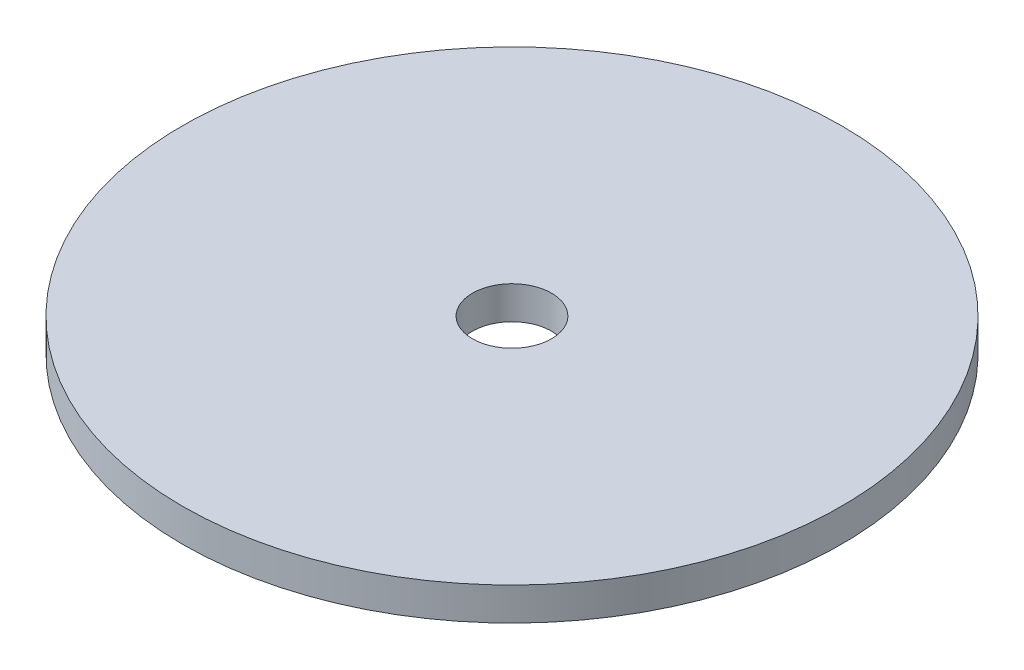
ISO-10303-21;
HEADER;
FILE_DESCRIPTION(('STEP AP214'),'2;1');
FILE_NAME('part.step','',(''),(''),'','','');
FILE_SCHEMA(('AUTOMOTIVE_DESIGN { 1 0 10303 214 1 1 1 1 }'));
ENDSEC;
DATA;
#1=APPLICATION_CONTEXT('core data for automotive mechanical design processes');
#2=APPLICATION_PROTOCOL_DEFINITION('international standard','automotive_design',2000,#1);
#3=PRODUCT_CONTEXT('',#1,'mechanical');
#4=PRODUCT('Part','Part','',(#3));
#5=PRODUCT_RELATED_PRODUCT_CATEGORY('part','',(#4));
#6=PRODUCT_DEFINITION_FORMATION('','',#4);
#7=PRODUCT_DEFINITION_CONTEXT('part definition',#1,'design');
#8=PRODUCT_DEFINITION('design','',#6,#7);
#9=PRODUCT_DEFINITION_SHAPE('','',#8);
#10=(LENGTH_UNIT() NAMED_UNIT(*) SI_UNIT(.MILLI.,.METRE.));
#11=(NAMED_UNIT(*) PLANE_ANGLE_UNIT() SI_UNIT($,.RADIAN.));
#12=(NAMED_UNIT(*) SI_UNIT($,.STERADIAN.) SOLID_ANGLE_UNIT());
#13=UNCERTAINTY_MEASURE_WITH_UNIT(LENGTH_MEASURE(1.E-05),#10,'distance_accuracy_value','');
#14=(GEOMETRIC_REPRESENTATION_CONTEXT(3) GLOBAL_UNCERTAINTY_ASSIGNED_CONTEXT((#13)) GLOBAL_UNIT_ASSIGNED_CONTEXT((#10,
#11,#12)) REPRESENTATION_CONTEXT('',''));
#15=CARTESIAN_POINT('',(0.,0.,0.));
#16=DIRECTION('',(0.,0.,1.));
#17=DIRECTION('',(1.,0.,0.));
#18=AXIS2_PLACEMENT_3D('',#15,#16,#17);
#19=CARTESIAN_POINT('',(0.,5.,0.));
#20=DIRECTION('',(0.,1.,0.));
#21=DIRECTION('',(0.,0.,1.));
#22=AXIS2_PLACEMENT_3D('',#19,#20,#21);
#23=PLANE('',#22);
#24=CARTESIAN_POINT('',(0.,5.,0.));
#25=DIRECTION('',(0.,1.,0.));
#26=DIRECTION('',(0.,0.,1.));
#27=AXIS2_PLACEMENT_3D('',#24,#25,#26);
#28=CIRCLE('',#27,50.);
#29=CARTESIAN_POINT('',(0.,5.,50.));
#30=VERTEX_POINT('',#29);
#31=EDGE_CURVE('E10',#30,#30,#28,.T.);
#32=ORIENTED_EDGE('',*,*,#31,.T.);
#33=EDGE_LOOP('',(#32));
#34=FACE_BOUND('',#33,.T.);
#35=CARTESIAN_POINT('',(0.,5.,0.));
#36=DIRECTION('',(0.,1.,0.));
#37=DIRECTION('',(0.,0.,1.));
#38=AXIS2_PLACEMENT_3D('',#35,#36,#37);
#39=CIRCLE('',#38,6.);
#40=CARTESIAN_POINT('',(0.,5.,6.));
#41=VERTEX_POINT('',#40);
#42=EDGE_CURVE('E43',#41,#41,#39,.T.);
#43=ORIENTED_EDGE('',*,*,#42,.F.);
#44=EDGE_LOOP('',(#43));
#45=FACE_BOUND('',#44,.T.);
#46=ADVANCED_FACE('F32',(#34,#45),#23,.T.);
#47=CARTESIAN_POINT('',(0.,0.,0.));
#48=DIRECTION('',(0.,1.,0.));
#49=DIRECTION('',(0.,0.,1.));
#50=AXIS2_PLACEMENT_3D('',#47,#48,#49);
#51=PLANE('',#50);
#52=CARTESIAN_POINT('',(0.,0.,0.));
#53=DIRECTION('',(0.,1.,0.));
#54=DIRECTION('',(0.,0.,1.));
#55=AXIS2_PLACEMENT_3D('',#52,#53,#54);
#56=CIRCLE('',#55,50.);
#57=CARTESIAN_POINT('',(0.,0.,50.));
#58=VERTEX_POINT('',#57);
#59=EDGE_CURVE('E36',#58,#58,#56,.T.);
#60=ORIENTED_EDGE('',*,*,#59,.F.);
#61=EDGE_LOOP('',(#60));
#62=FACE_BOUND('',#61,.T.);
#63=CARTESIAN_POINT('',(0.,0.,0.));
#64=DIRECTION('',(0.,1.,0.));
#65=DIRECTION('',(0.,0.,1.));
#66=AXIS2_PLACEMENT_3D('',#63,#64,#65);
#67=CIRCLE('',#66,6.);
#68=CARTESIAN_POINT('',(0.,0.,6.));
#69=VERTEX_POINT('',#68);
#70=EDGE_CURVE('E45',#69,#69,#67,.T.);
#71=ORIENTED_EDGE('',*,*,#70,.T.);
#72=EDGE_LOOP('',(#71));
#73=FACE_BOUND('',#72,.T.);
#74=ADVANCED_FACE('F55',(#62,#73),#51,.F.);
#75=CARTESIAN_POINT('',(0.,5.,0.));
#76=DIRECTION('',(0.,-1.,0.));
#77=DIRECTION('',(0.,0.,-1.));
#78=AXIS2_PLACEMENT_3D('',#75,#76,#77);
#79=CYLINDRICAL_SURFACE('',#78,50.);
#80=ORIENTED_EDGE('',*,*,#31,.F.);
#81=EDGE_LOOP('',(#80));
#82=FACE_BOUND('',#81,.T.);
#83=ORIENTED_EDGE('',*,*,#59,.T.);
#84=EDGE_LOOP('',(#83));
#85=FACE_BOUND('',#84,.T.);
#86=ADVANCED_FACE('F34',(#82,#85),#79,.T.);
#87=CARTESIAN_POINT('',(0.,5.,0.));
#88=DIRECTION('',(0.,-1.,0.));
#89=DIRECTION('',(0.,0.,-1.));
#90=AXIS2_PLACEMENT_3D('',#87,#88,#89);
#91=CYLINDRICAL_SURFACE('',#90,6.);
#92=ORIENTED_EDGE('',*,*,#42,.T.);
#93=EDGE_LOOP('',(#92));
#94=FACE_BOUND('',#93,.T.);
#95=ORIENTED_EDGE('',*,*,#70,.F.);
#96=EDGE_LOOP('',(#95));
#97=FACE_BOUND('',#96,.T.);
#98=ADVANCED_FACE('F51',(#94,#97),#91,.F.);
#99=CLOSED_SHELL('',(#46,#74,#86,#98));
#100=MANIFOLD_SOLID_BREP('B2',#99);
#101=ADVANCED_BREP_SHAPE_REPRESENTATION('',(#18,#100),#14);
#102=SHAPE_DEFINITION_REPRESENTATION(#9,#101);
ENDSEC;
END-ISO-10303-21;
